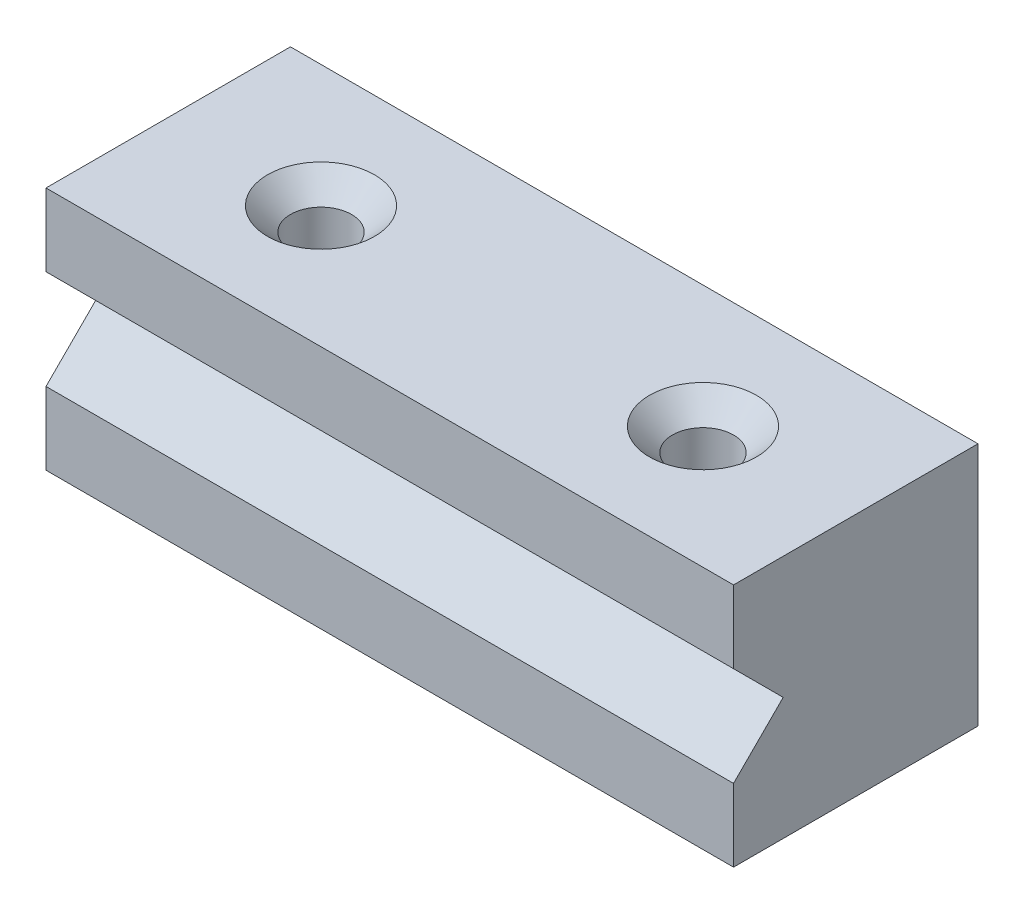
ISO-10303-21;
HEADER;
FILE_DESCRIPTION(('STEP AP214'),'2;1');
FILE_NAME('part.step','',(''),(''),'','','');
FILE_SCHEMA(('AUTOMOTIVE_DESIGN { 1 0 10303 214 1 1 1 1 }'));
ENDSEC;
DATA;
#1=APPLICATION_CONTEXT('core data for automotive mechanical design processes');
#2=APPLICATION_PROTOCOL_DEFINITION('international standard','automotive_design',2000,#1);
#3=PRODUCT_CONTEXT('',#1,'mechanical');
#4=PRODUCT('Part','Part','',(#3));
#5=PRODUCT_RELATED_PRODUCT_CATEGORY('part','',(#4));
#6=PRODUCT_DEFINITION_FORMATION('','',#4);
#7=PRODUCT_DEFINITION_CONTEXT('part definition',#1,'design');
#8=PRODUCT_DEFINITION('design','',#6,#7);
#9=PRODUCT_DEFINITION_SHAPE('','',#8);
#10=(LENGTH_UNIT() NAMED_UNIT(*) SI_UNIT(.MILLI.,.METRE.));
#11=(NAMED_UNIT(*) PLANE_ANGLE_UNIT() SI_UNIT($,.RADIAN.));
#12=(NAMED_UNIT(*) SI_UNIT($,.STERADIAN.) SOLID_ANGLE_UNIT());
#13=UNCERTAINTY_MEASURE_WITH_UNIT(LENGTH_MEASURE(1.E-05),#10,'distance_accuracy_value','');
#14=(GEOMETRIC_REPRESENTATION_CONTEXT(3) GLOBAL_UNCERTAINTY_ASSIGNED_CONTEXT((#13)) GLOBAL_UNIT_ASSIGNED_CONTEXT((#10,
#11,#12)) REPRESENTATION_CONTEXT('',''));
#15=CARTESIAN_POINT('',(0.,0.,0.));
#16=DIRECTION('',(0.,0.,1.));
#17=DIRECTION('',(1.,0.,0.));
#18=AXIS2_PLACEMENT_3D('',#15,#16,#17);
#19=CARTESIAN_POINT('',(0.,0.,16.));
#20=DIRECTION('',(0.,0.,-1.));
#21=DIRECTION('',(-1.,0.,0.));
#22=AXIS2_PLACEMENT_3D('',#19,#20,#21);
#23=PLANE('',#22);
#24=DIRECTION('',(0.,-1.,0.));
#25=VECTOR('',#24,1.);
#26=CARTESIAN_POINT('',(-45.,-16.,16.));
#27=LINE('',#26,#25);
#28=CARTESIAN_POINT('',(-45.,16.,16.));
#29=VERTEX_POINT('',#28);
#30=CARTESIAN_POINT('',(-45.,6.5,16.));
#31=VERTEX_POINT('',#30);
#32=EDGE_CURVE('E162',#29,#31,#27,.T.);
#33=ORIENTED_EDGE('',*,*,#32,.T.);
#34=DIRECTION('',(1.,0.,0.));
#35=VECTOR('',#34,1.);
#36=CARTESIAN_POINT('',(-45.,6.5,16.));
#37=LINE('',#36,#35);
#38=CARTESIAN_POINT('',(45.,6.5,16.));
#39=VERTEX_POINT('',#38);
#40=EDGE_CURVE('E125',#31,#39,#37,.T.);
#41=ORIENTED_EDGE('',*,*,#40,.T.);
#42=DIRECTION('',(0.,1.,0.));
#43=VECTOR('',#42,1.);
#44=CARTESIAN_POINT('',(45.,-16.,16.));
#45=LINE('',#44,#43);
#46=CARTESIAN_POINT('',(45.,16.,16.));
#47=VERTEX_POINT('',#46);
#48=EDGE_CURVE('E102',#39,#47,#45,.T.);
#49=ORIENTED_EDGE('',*,*,#48,.T.);
#50=DIRECTION('',(-1.,0.,0.));
#51=VECTOR('',#50,1.);
#52=CARTESIAN_POINT('',(-45.,16.,16.));
#53=LINE('',#52,#51);
#54=EDGE_CURVE('E159',#47,#29,#53,.T.);
#55=ORIENTED_EDGE('',*,*,#54,.T.);
#56=EDGE_LOOP('',(#33,#41,#49,#55));
#57=FACE_BOUND('',#56,.T.);
#58=ADVANCED_FACE('F47',(#57),#23,.F.);
#59=CARTESIAN_POINT('',(45.,-16.,16.));
#60=DIRECTION('',(-1.,0.,0.));
#61=DIRECTION('',(0.,0.,1.));
#62=AXIS2_PLACEMENT_3D('',#59,#60,#61);
#63=PLANE('',#62);
#64=ORIENTED_EDGE('',*,*,#48,.F.);
#65=DIRECTION('',(0.,0.707106781186546,0.707106781186549));
#66=VECTOR('',#65,1.);
#67=CARTESIAN_POINT('',(45.,6.5,16.));
#68=LINE('',#67,#66);
#69=CARTESIAN_POINT('',(45.,0.,9.49999999999998));
#70=VERTEX_POINT('',#69);
#71=EDGE_CURVE('E141',#70,#39,#68,.T.);
#72=ORIENTED_EDGE('',*,*,#71,.F.);
#73=DIRECTION('',(0.,0.707106781186546,-0.707106781186549));
#74=VECTOR('',#73,1.);
#75=CARTESIAN_POINT('',(45.,0.,9.49999999999998));
#76=LINE('',#75,#74);
#77=CARTESIAN_POINT('',(45.,-6.5,16.));
#78=VERTEX_POINT('',#77);
#79=EDGE_CURVE('E121',#78,#70,#76,.T.);
#80=ORIENTED_EDGE('',*,*,#79,.F.);
#81=CARTESIAN_POINT('',(45.,-16.,16.));
#82=VERTEX_POINT('',#81);
#83=EDGE_CURVE('E156',#82,#78,#45,.T.);
#84=ORIENTED_EDGE('',*,*,#83,.F.);
#85=DIRECTION('',(0.,0.,-1.));
#86=VECTOR('',#85,1.);
#87=CARTESIAN_POINT('',(45.,-16.,16.));
#88=LINE('',#87,#86);
#89=CARTESIAN_POINT('',(45.,-16.,-16.));
#90=VERTEX_POINT('',#89);
#91=EDGE_CURVE('E167',#82,#90,#88,.T.);
#92=ORIENTED_EDGE('',*,*,#91,.T.);
#93=DIRECTION('',(0.,1.,0.));
#94=VECTOR('',#93,1.);
#95=CARTESIAN_POINT('',(45.,-16.,-16.));
#96=LINE('',#95,#94);
#97=CARTESIAN_POINT('',(45.,16.,-16.));
#98=VERTEX_POINT('',#97);
#99=EDGE_CURVE('E152',#90,#98,#96,.T.);
#100=ORIENTED_EDGE('',*,*,#99,.T.);
#101=DIRECTION('',(0.,0.,-1.));
#102=VECTOR('',#101,1.);
#103=CARTESIAN_POINT('',(45.,16.,16.));
#104=LINE('',#103,#102);
#105=EDGE_CURVE('E188',#47,#98,#104,.T.);
#106=ORIENTED_EDGE('',*,*,#105,.F.);
#107=EDGE_LOOP('',(#64,#72,#80,#84,#92,#100,#106));
#108=FACE_BOUND('',#107,.T.);
#109=ADVANCED_FACE('F233',(#108),#63,.F.);
#110=CARTESIAN_POINT('',(-45.,16.,16.));
#111=DIRECTION('',(0.,-1.,0.));
#112=DIRECTION('',(0.,0.,-1.));
#113=AXIS2_PLACEMENT_3D('',#110,#111,#112);
#114=PLANE('',#113);
#115=CARTESIAN_POINT('',(25.,16.,0.));
#116=DIRECTION('',(0.,-1.,0.));
#117=DIRECTION('',(0.,0.,-1.));
#118=AXIS2_PLACEMENT_3D('',#115,#116,#117);
#119=CIRCLE('',#118,7.00000000000002);
#120=CARTESIAN_POINT('',(25.,16.,-7.00000000000002));
#121=VERTEX_POINT('',#120);
#122=EDGE_CURVE('E57',#121,#121,#119,.T.);
#123=ORIENTED_EDGE('',*,*,#122,.T.);
#124=EDGE_LOOP('',(#123));
#125=FACE_BOUND('',#124,.T.);
#126=CARTESIAN_POINT('',(-25.,16.,0.));
#127=DIRECTION('',(0.,-1.,0.));
#128=DIRECTION('',(0.,0.,-1.));
#129=AXIS2_PLACEMENT_3D('',#126,#127,#128);
#130=CIRCLE('',#129,7.00000000000002);
#131=CARTESIAN_POINT('',(-25.,16.,-7.00000000000002));
#132=VERTEX_POINT('',#131);
#133=EDGE_CURVE('E196',#132,#132,#130,.T.);
#134=ORIENTED_EDGE('',*,*,#133,.T.);
#135=EDGE_LOOP('',(#134));
#136=FACE_BOUND('',#135,.T.);
#137=DIRECTION('',(-1.,0.,0.));
#138=VECTOR('',#137,1.);
#139=CARTESIAN_POINT('',(-45.,16.,-16.));
#140=LINE('',#139,#138);
#141=CARTESIAN_POINT('',(-45.,16.,-16.));
#142=VERTEX_POINT('',#141);
#143=EDGE_CURVE('E171',#98,#142,#140,.T.);
#144=ORIENTED_EDGE('',*,*,#143,.T.);
#145=DIRECTION('',(0.,0.,-1.));
#146=VECTOR('',#145,1.);
#147=CARTESIAN_POINT('',(-45.,16.,16.));
#148=LINE('',#147,#146);
#149=EDGE_CURVE('E184',#29,#142,#148,.T.);
#150=ORIENTED_EDGE('',*,*,#149,.F.);
#151=ORIENTED_EDGE('',*,*,#54,.F.);
#152=ORIENTED_EDGE('',*,*,#105,.T.);
#153=EDGE_LOOP('',(#144,#150,#151,#152));
#154=FACE_BOUND('',#153,.T.);
#155=ADVANCED_FACE('F203',(#125,#136,#154),#114,.F.);
#156=CARTESIAN_POINT('',(-45.,-16.,16.));
#157=DIRECTION('',(1.,0.,0.));
#158=DIRECTION('',(0.,0.,-1.));
#159=AXIS2_PLACEMENT_3D('',#156,#157,#158);
#160=PLANE('',#159);
#161=DIRECTION('',(0.,0.707106781186546,-0.707106781186549));
#162=VECTOR('',#161,1.);
#163=CARTESIAN_POINT('',(-45.,0.,9.49999999999998));
#164=LINE('',#163,#162);
#165=CARTESIAN_POINT('',(-45.,-6.5,16.));
#166=VERTEX_POINT('',#165);
#167=CARTESIAN_POINT('',(-45.,0.,9.49999999999998));
#168=VERTEX_POINT('',#167);
#169=EDGE_CURVE('E64',#166,#168,#164,.T.);
#170=ORIENTED_EDGE('',*,*,#169,.T.);
#171=DIRECTION('',(0.,0.707106781186546,0.707106781186549));
#172=VECTOR('',#171,1.);
#173=CARTESIAN_POINT('',(-45.,6.5,16.));
#174=LINE('',#173,#172);
#175=EDGE_CURVE('E129',#168,#31,#174,.T.);
#176=ORIENTED_EDGE('',*,*,#175,.T.);
#177=ORIENTED_EDGE('',*,*,#32,.F.);
#178=ORIENTED_EDGE('',*,*,#149,.T.);
#179=DIRECTION('',(0.,-1.,0.));
#180=VECTOR('',#179,1.);
#181=CARTESIAN_POINT('',(-45.,-16.,-16.));
#182=LINE('',#181,#180);
#183=CARTESIAN_POINT('',(-45.,-16.,-16.));
#184=VERTEX_POINT('',#183);
#185=EDGE_CURVE('E174',#142,#184,#182,.T.);
#186=ORIENTED_EDGE('',*,*,#185,.T.);
#187=DIRECTION('',(0.,0.,-1.));
#188=VECTOR('',#187,1.);
#189=CARTESIAN_POINT('',(-45.,-16.,16.));
#190=LINE('',#189,#188);
#191=CARTESIAN_POINT('',(-45.,-16.,16.));
#192=VERTEX_POINT('',#191);
#193=EDGE_CURVE('E181',#192,#184,#190,.T.);
#194=ORIENTED_EDGE('',*,*,#193,.F.);
#195=EDGE_CURVE('E139',#166,#192,#27,.T.);
#196=ORIENTED_EDGE('',*,*,#195,.F.);
#197=EDGE_LOOP('',(#170,#176,#177,#178,#186,#194,#196));
#198=FACE_BOUND('',#197,.T.);
#199=ADVANCED_FACE('F137',(#198),#160,.F.);
#200=CARTESIAN_POINT('',(-45.,-16.,16.));
#201=DIRECTION('',(0.,1.,0.));
#202=DIRECTION('',(0.,0.,1.));
#203=AXIS2_PLACEMENT_3D('',#200,#201,#202);
#204=PLANE('',#203);
#205=CARTESIAN_POINT('',(-25.,-16.,0.));
#206=DIRECTION('',(0.,1.,0.));
#207=DIRECTION('',(0.,0.,1.));
#208=AXIS2_PLACEMENT_3D('',#205,#206,#207);
#209=CIRCLE('',#208,3.99999999999999);
#210=CARTESIAN_POINT('',(-25.,-16.,3.99999999999999));
#211=VERTEX_POINT('',#210);
#212=EDGE_CURVE('E220',#211,#211,#209,.T.);
#213=ORIENTED_EDGE('',*,*,#212,.T.);
#214=EDGE_LOOP('',(#213));
#215=FACE_BOUND('',#214,.T.);
#216=CARTESIAN_POINT('',(25.,-16.,0.));
#217=DIRECTION('',(0.,1.,0.));
#218=DIRECTION('',(0.,0.,1.));
#219=AXIS2_PLACEMENT_3D('',#216,#217,#218);
#220=CIRCLE('',#219,3.99999999999999);
#221=CARTESIAN_POINT('',(25.,-16.,3.99999999999999));
#222=VERTEX_POINT('',#221);
#223=EDGE_CURVE('E146',#222,#222,#220,.T.);
#224=ORIENTED_EDGE('',*,*,#223,.T.);
#225=EDGE_LOOP('',(#224));
#226=FACE_BOUND('',#225,.T.);
#227=DIRECTION('',(1.,0.,0.));
#228=VECTOR('',#227,1.);
#229=CARTESIAN_POINT('',(-45.,-16.,-16.));
#230=LINE('',#229,#228);
#231=EDGE_CURVE('E94',#184,#90,#230,.T.);
#232=ORIENTED_EDGE('',*,*,#231,.T.);
#233=ORIENTED_EDGE('',*,*,#91,.F.);
#234=DIRECTION('',(1.,0.,0.));
#235=VECTOR('',#234,1.);
#236=CARTESIAN_POINT('',(-45.,-16.,16.));
#237=LINE('',#236,#235);
#238=EDGE_CURVE('E73',#192,#82,#237,.T.);
#239=ORIENTED_EDGE('',*,*,#238,.F.);
#240=ORIENTED_EDGE('',*,*,#193,.T.);
#241=EDGE_LOOP('',(#232,#233,#239,#240));
#242=FACE_BOUND('',#241,.T.);
#243=ADVANCED_FACE('F225',(#215,#226,#242),#204,.F.);
#244=ORIENTED_EDGE('',*,*,#83,.T.);
#245=DIRECTION('',(1.,0.,0.));
#246=VECTOR('',#245,1.);
#247=CARTESIAN_POINT('',(-45.,-6.5,16.));
#248=LINE('',#247,#246);
#249=EDGE_CURVE('E126',#166,#78,#248,.T.);
#250=ORIENTED_EDGE('',*,*,#249,.F.);
#251=ORIENTED_EDGE('',*,*,#195,.T.);
#252=ORIENTED_EDGE('',*,*,#238,.T.);
#253=EDGE_LOOP('',(#244,#250,#251,#252));
#254=FACE_BOUND('',#253,.T.);
#255=ADVANCED_FACE('F235',(#254),#23,.F.);
#256=CARTESIAN_POINT('',(0.,0.,-16.));
#257=DIRECTION('',(0.,0.,-1.));
#258=DIRECTION('',(-1.,0.,0.));
#259=AXIS2_PLACEMENT_3D('',#256,#257,#258);
#260=PLANE('',#259);
#261=ORIENTED_EDGE('',*,*,#99,.F.);
#262=ORIENTED_EDGE('',*,*,#231,.F.);
#263=ORIENTED_EDGE('',*,*,#185,.F.);
#264=ORIENTED_EDGE('',*,*,#143,.F.);
#265=EDGE_LOOP('',(#261,#262,#263,#264));
#266=FACE_BOUND('',#265,.T.);
#267=ADVANCED_FACE('F244',(#266),#260,.T.);
#268=CARTESIAN_POINT('',(-45.,6.5,16.));
#269=DIRECTION('',(0.,0.707106781186549,-0.707106781186546));
#270=DIRECTION('',(0.,0.707106781186546,0.707106781186549));
#271=AXIS2_PLACEMENT_3D('',#268,#269,#270);
#272=PLANE('',#271);
#273=ORIENTED_EDGE('',*,*,#71,.T.);
#274=ORIENTED_EDGE('',*,*,#40,.F.);
#275=ORIENTED_EDGE('',*,*,#175,.F.);
#276=DIRECTION('',(1.,0.,0.));
#277=VECTOR('',#276,1.);
#278=CARTESIAN_POINT('',(-45.,0.,9.49999999999998));
#279=LINE('',#278,#277);
#280=EDGE_CURVE('E117',#168,#70,#279,.T.);
#281=ORIENTED_EDGE('',*,*,#280,.T.);
#282=EDGE_LOOP('',(#273,#274,#275,#281));
#283=FACE_BOUND('',#282,.T.);
#284=ADVANCED_FACE('F130',(#283),#272,.F.);
#285=CARTESIAN_POINT('',(-45.,0.,9.49999999999998));
#286=DIRECTION('',(0.,-0.707106781186549,-0.707106781186546));
#287=DIRECTION('',(0.,0.707106781186546,-0.707106781186549));
#288=AXIS2_PLACEMENT_3D('',#285,#286,#287);
#289=PLANE('',#288);
#290=ORIENTED_EDGE('',*,*,#79,.T.);
#291=ORIENTED_EDGE('',*,*,#280,.F.);
#292=ORIENTED_EDGE('',*,*,#169,.F.);
#293=ORIENTED_EDGE('',*,*,#249,.T.);
#294=EDGE_LOOP('',(#290,#291,#292,#293));
#295=FACE_BOUND('',#294,.T.);
#296=ADVANCED_FACE('F119',(#295),#289,.F.);
#297=CARTESIAN_POINT('',(25.,16.,0.));
#298=DIRECTION('',(0.,1.,0.));
#299=DIRECTION('',(0.,0.,1.));
#300=AXIS2_PLACEMENT_3D('',#297,#298,#299);
#301=CYLINDRICAL_SURFACE('',#300,3.99999999999999);
#302=CARTESIAN_POINT('',(25.,13.,0.));
#303=DIRECTION('',(0.,-1.,0.));
#304=DIRECTION('',(0.,0.,-1.));
#305=AXIS2_PLACEMENT_3D('',#302,#303,#304);
#306=CIRCLE('',#305,3.99999999999999);
#307=CARTESIAN_POINT('',(25.,13.,-3.99999999999999));
#308=VERTEX_POINT('',#307);
#309=EDGE_CURVE('E192',#308,#308,#306,.F.);
#310=ORIENTED_EDGE('',*,*,#309,.T.);
#311=EDGE_LOOP('',(#310));
#312=FACE_BOUND('',#311,.T.);
#313=ORIENTED_EDGE('',*,*,#223,.F.);
#314=EDGE_LOOP('',(#313));
#315=FACE_BOUND('',#314,.T.);
#316=ADVANCED_FACE('F212',(#312,#315),#301,.F.);
#317=CARTESIAN_POINT('',(-25.,16.,0.));
#318=DIRECTION('',(0.,1.,0.));
#319=DIRECTION('',(0.,0.,1.));
#320=AXIS2_PLACEMENT_3D('',#317,#318,#319);
#321=CYLINDRICAL_SURFACE('',#320,3.99999999999999);
#322=CARTESIAN_POINT('',(-25.,13.,0.));
#323=DIRECTION('',(0.,-1.,0.));
#324=DIRECTION('',(0.,0.,-1.));
#325=AXIS2_PLACEMENT_3D('',#322,#323,#324);
#326=CIRCLE('',#325,3.99999999999999);
#327=CARTESIAN_POINT('',(-25.,13.,-3.99999999999999));
#328=VERTEX_POINT('',#327);
#329=EDGE_CURVE('E11',#328,#328,#326,.F.);
#330=ORIENTED_EDGE('',*,*,#329,.T.);
#331=EDGE_LOOP('',(#330));
#332=FACE_BOUND('',#331,.T.);
#333=ORIENTED_EDGE('',*,*,#212,.F.);
#334=EDGE_LOOP('',(#333));
#335=FACE_BOUND('',#334,.T.);
#336=ADVANCED_FACE('F209',(#332,#335),#321,.F.);
#337=CARTESIAN_POINT('',(25.,13.,0.));
#338=DIRECTION('',(0.,1.,0.));
#339=DIRECTION('',(0.,0.,1.));
#340=AXIS2_PLACEMENT_3D('',#337,#338,#339);
#341=CONICAL_SURFACE('',#340,3.99999999999999,0.785398163397451);
#342=ORIENTED_EDGE('',*,*,#122,.F.);
#343=EDGE_LOOP('',(#342));
#344=FACE_BOUND('',#343,.T.);
#345=ORIENTED_EDGE('',*,*,#309,.F.);
#346=EDGE_LOOP('',(#345));
#347=FACE_BOUND('',#346,.T.);
#348=ADVANCED_FACE('F206',(#344,#347),#341,.F.);
#349=CARTESIAN_POINT('',(-25.,13.,0.));
#350=DIRECTION('',(0.,1.,0.));
#351=DIRECTION('',(0.,0.,1.));
#352=AXIS2_PLACEMENT_3D('',#349,#350,#351);
#353=CONICAL_SURFACE('',#352,3.99999999999999,0.785398163397451);
#354=ORIENTED_EDGE('',*,*,#133,.F.);
#355=EDGE_LOOP('',(#354));
#356=FACE_BOUND('',#355,.T.);
#357=ORIENTED_EDGE('',*,*,#329,.F.);
#358=EDGE_LOOP('',(#357));
#359=FACE_BOUND('',#358,.T.);
#360=ADVANCED_FACE('F50',(#356,#359),#353,.F.);
#361=CLOSED_SHELL('',(#58,#109,#155,#199,#243,#255,#267,#284,#296,#316,#336,#348,#360));
#362=MANIFOLD_SOLID_BREP('B2',#361);
#363=ADVANCED_BREP_SHAPE_REPRESENTATION('',(#18,#362),#14);
#364=SHAPE_DEFINITION_REPRESENTATION(#9,#363);
ENDSEC;
END-ISO-10303-21;
